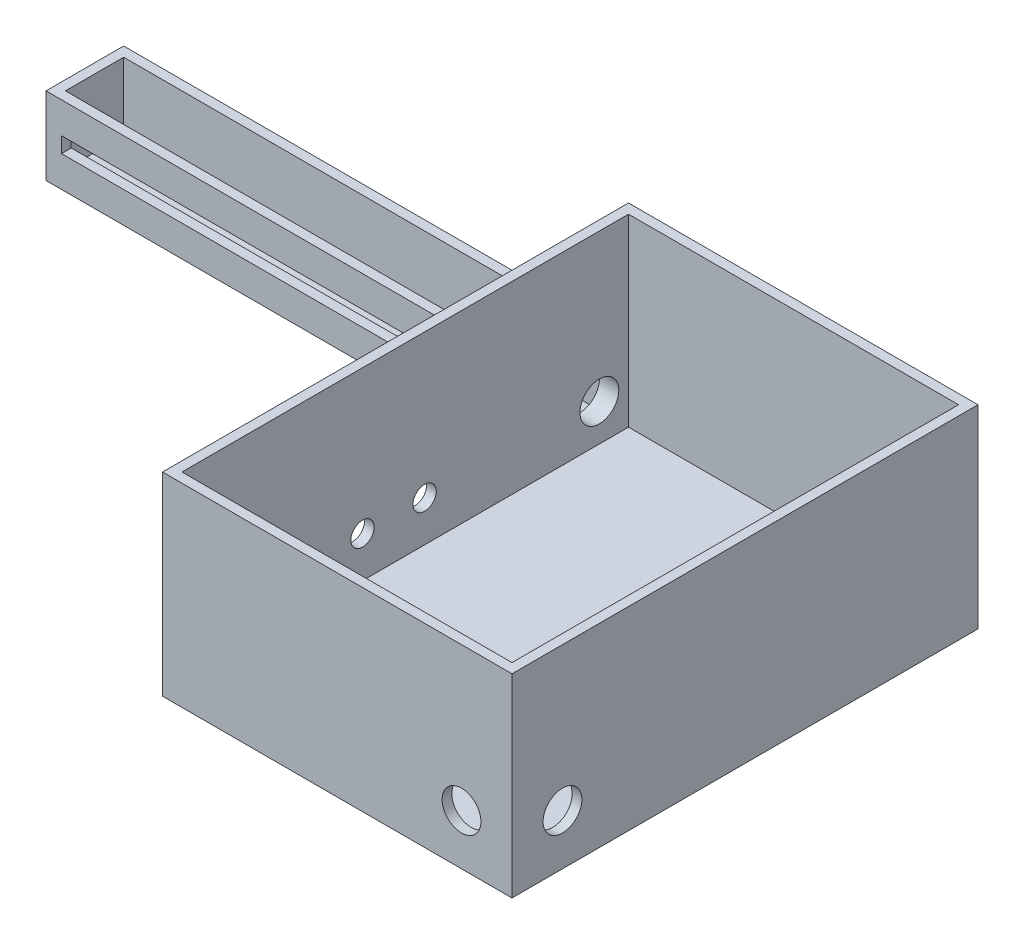
ISO-10303-21;
HEADER;
FILE_DESCRIPTION(('STEP AP214'),'2;1');
FILE_NAME('part.step','',(''),(''),'','','');
FILE_SCHEMA(('AUTOMOTIVE_DESIGN { 1 0 10303 214 1 1 1 1 }'));
ENDSEC;
DATA;
#1=APPLICATION_CONTEXT('core data for automotive mechanical design processes');
#2=APPLICATION_PROTOCOL_DEFINITION('international standard','automotive_design',2000,#1);
#3=PRODUCT_CONTEXT('',#1,'mechanical');
#4=PRODUCT('Part','Part','',(#3));
#5=PRODUCT_RELATED_PRODUCT_CATEGORY('part','',(#4));
#6=PRODUCT_DEFINITION_FORMATION('','',#4);
#7=PRODUCT_DEFINITION_CONTEXT('part definition',#1,'design');
#8=PRODUCT_DEFINITION('design','',#6,#7);
#9=PRODUCT_DEFINITION_SHAPE('','',#8);
#10=(LENGTH_UNIT() NAMED_UNIT(*) SI_UNIT(.MILLI.,.METRE.));
#11=(NAMED_UNIT(*) PLANE_ANGLE_UNIT() SI_UNIT($,.RADIAN.));
#12=(NAMED_UNIT(*) SI_UNIT($,.STERADIAN.) SOLID_ANGLE_UNIT());
#13=UNCERTAINTY_MEASURE_WITH_UNIT(LENGTH_MEASURE(1.E-05),#10,'distance_accuracy_value','');
#14=(GEOMETRIC_REPRESENTATION_CONTEXT(3) GLOBAL_UNCERTAINTY_ASSIGNED_CONTEXT((#13)) GLOBAL_UNIT_ASSIGNED_CONTEXT((#10,
#11,#12)) REPRESENTATION_CONTEXT('',''));
#15=CARTESIAN_POINT('',(0.,0.,0.));
#16=DIRECTION('',(0.,0.,1.));
#17=DIRECTION('',(1.,0.,0.));
#18=AXIS2_PLACEMENT_3D('',#15,#16,#17);
#19=CARTESIAN_POINT('',(-82.55,63.5,-12.7));
#20=DIRECTION('',(1.,0.,0.));
#21=DIRECTION('',(0.,0.,-1.));
#22=AXIS2_PLACEMENT_3D('',#19,#20,#21);
#23=PLANE('',#22);
#24=DIRECTION('',(0.,0.,1.));
#25=VECTOR('',#24,1.);
#26=CARTESIAN_POINT('',(-82.55,25.4,-12.7));
#27=LINE('',#26,#25);
#28=CARTESIAN_POINT('',(-82.55,25.4,-12.7));
#29=VERTEX_POINT('',#28);
#30=CARTESIAN_POINT('',(-82.55,25.4,12.7));
#31=VERTEX_POINT('',#30);
#32=EDGE_CURVE('E256',#29,#31,#27,.T.);
#33=ORIENTED_EDGE('',*,*,#32,.F.);
#34=DIRECTION('',(0.,-1.,0.));
#35=VECTOR('',#34,1.);
#36=CARTESIAN_POINT('',(-82.55,63.5,-12.7));
#37=LINE('',#36,#35);
#38=CARTESIAN_POINT('',(-82.55,0.,-12.7));
#39=VERTEX_POINT('',#38);
#40=EDGE_CURVE('E306',#29,#39,#37,.T.);
#41=ORIENTED_EDGE('',*,*,#40,.T.);
#42=DIRECTION('',(0.,0.,1.));
#43=VECTOR('',#42,1.);
#44=CARTESIAN_POINT('',(-82.55,0.,-12.7));
#45=LINE('',#44,#43);
#46=CARTESIAN_POINT('',(-82.55,0.,12.7));
#47=VERTEX_POINT('',#46);
#48=EDGE_CURVE('E298',#39,#47,#45,.T.);
#49=ORIENTED_EDGE('',*,*,#48,.T.);
#50=DIRECTION('',(0.,-1.,0.));
#51=VECTOR('',#50,1.);
#52=CARTESIAN_POINT('',(-82.55,63.5,12.7));
#53=LINE('',#52,#51);
#54=EDGE_CURVE('E304',#31,#47,#53,.T.);
#55=ORIENTED_EDGE('',*,*,#54,.F.);
#56=EDGE_LOOP('',(#33,#41,#49,#55));
#57=FACE_BOUND('',#56,.T.);
#58=ADVANCED_FACE('F33',(#57),#23,.F.);
#59=CARTESIAN_POINT('',(-82.55,63.5,12.7));
#60=DIRECTION('',(0.,0.,-1.));
#61=DIRECTION('',(-1.,0.,0.));
#62=AXIS2_PLACEMENT_3D('',#59,#60,#61);
#63=PLANE('',#62);
#64=DIRECTION('',(1.,0.,0.));
#65=VECTOR('',#64,1.);
#66=CARTESIAN_POINT('',(-77.47,10.16,12.7));
#67=LINE('',#66,#65);
#68=CARTESIAN_POINT('',(-77.47,10.16,12.7));
#69=VERTEX_POINT('',#68);
#70=CARTESIAN_POINT('',(77.47,10.16,12.7));
#71=VERTEX_POINT('',#70);
#72=EDGE_CURVE('E178',#69,#71,#67,.T.);
#73=ORIENTED_EDGE('',*,*,#72,.F.);
#74=DIRECTION('',(0.,-1.,0.));
#75=VECTOR('',#74,1.);
#76=CARTESIAN_POINT('',(-77.47,15.24,12.7));
#77=LINE('',#76,#75);
#78=CARTESIAN_POINT('',(-77.47,15.24,12.7));
#79=VERTEX_POINT('',#78);
#80=EDGE_CURVE('E50',#79,#69,#77,.T.);
#81=ORIENTED_EDGE('',*,*,#80,.F.);
#82=DIRECTION('',(-1.,0.,0.));
#83=VECTOR('',#82,1.);
#84=CARTESIAN_POINT('',(-77.47,15.24,12.7));
#85=LINE('',#84,#83);
#86=CARTESIAN_POINT('',(77.47,15.24,12.7));
#87=VERTEX_POINT('',#86);
#88=EDGE_CURVE('E185',#87,#79,#85,.T.);
#89=ORIENTED_EDGE('',*,*,#88,.F.);
#90=DIRECTION('',(0.,1.,0.));
#91=VECTOR('',#90,1.);
#92=CARTESIAN_POINT('',(77.47,15.24,12.7));
#93=LINE('',#92,#91);
#94=EDGE_CURVE('E169',#71,#87,#93,.T.);
#95=ORIENTED_EDGE('',*,*,#94,.F.);
#96=EDGE_LOOP('',(#73,#81,#89,#95));
#97=FACE_BOUND('',#96,.T.);
#98=DIRECTION('',(1.,0.,0.));
#99=VECTOR('',#98,1.);
#100=CARTESIAN_POINT('',(-82.55,25.4,12.7));
#101=LINE('',#100,#99);
#102=CARTESIAN_POINT('',(82.55,25.4,12.7));
#103=VERTEX_POINT('',#102);
#104=EDGE_CURVE('E264',#31,#103,#101,.T.);
#105=ORIENTED_EDGE('',*,*,#104,.F.);
#106=ORIENTED_EDGE('',*,*,#54,.T.);
#107=DIRECTION('',(1.,0.,0.));
#108=VECTOR('',#107,1.);
#109=CARTESIAN_POINT('',(-82.55,0.,12.7));
#110=LINE('',#109,#108);
#111=CARTESIAN_POINT('',(82.55,0.,12.7));
#112=VERTEX_POINT('',#111);
#113=EDGE_CURVE('E280',#47,#112,#110,.T.);
#114=ORIENTED_EDGE('',*,*,#113,.T.);
#115=DIRECTION('',(0.,-1.,0.));
#116=VECTOR('',#115,1.);
#117=CARTESIAN_POINT('',(82.55,63.5,12.7));
#118=LINE('',#117,#116);
#119=EDGE_CURVE('E287',#103,#112,#118,.T.);
#120=ORIENTED_EDGE('',*,*,#119,.F.);
#121=EDGE_LOOP('',(#105,#106,#114,#120));
#122=FACE_BOUND('',#121,.T.);
#123=ADVANCED_FACE('F182',(#97,#122),#63,.F.);
#124=CARTESIAN_POINT('',(82.55,63.5,12.7));
#125=DIRECTION('',(1.,0.,0.));
#126=DIRECTION('',(0.,0.,-1.));
#127=AXIS2_PLACEMENT_3D('',#124,#125,#126);
#128=PLANE('',#127);
#129=CARTESIAN_POINT('',(82.55,16.51,57.15));
#130=DIRECTION('',(-1.,0.,0.));
#131=DIRECTION('',(0.,0.,1.));
#132=AXIS2_PLACEMENT_3D('',#129,#130,#131);
#133=CIRCLE('',#132,3.81);
#134=CARTESIAN_POINT('',(82.55,16.51,60.96));
#135=VERTEX_POINT('',#134);
#136=EDGE_CURVE('E328',#135,#135,#133,.T.);
#137=ORIENTED_EDGE('',*,*,#136,.F.);
#138=EDGE_LOOP('',(#137));
#139=FACE_BOUND('',#138,.T.);
#140=CARTESIAN_POINT('',(82.55,16.51,77.47));
#141=DIRECTION('',(-1.,0.,0.));
#142=DIRECTION('',(0.,0.,1.));
#143=AXIS2_PLACEMENT_3D('',#140,#141,#142);
#144=CIRCLE('',#143,3.81);
#145=CARTESIAN_POINT('',(82.55,16.51,81.28));
#146=VERTEX_POINT('',#145);
#147=EDGE_CURVE('E340',#146,#146,#144,.T.);
#148=ORIENTED_EDGE('',*,*,#147,.F.);
#149=EDGE_LOOP('',(#148));
#150=FACE_BOUND('',#149,.T.);
#151=CARTESIAN_POINT('',(82.55,16.51,97.79));
#152=DIRECTION('',(-1.,0.,0.));
#153=DIRECTION('',(0.,0.,1.));
#154=AXIS2_PLACEMENT_3D('',#151,#152,#153);
#155=CIRCLE('',#154,3.81);
#156=CARTESIAN_POINT('',(82.55,16.51,101.6));
#157=VERTEX_POINT('',#156);
#158=EDGE_CURVE('E335',#157,#157,#155,.T.);
#159=ORIENTED_EDGE('',*,*,#158,.F.);
#160=EDGE_LOOP('',(#159));
#161=FACE_BOUND('',#160,.T.);
#162=DIRECTION('',(0.,0.,1.));
#163=VECTOR('',#162,1.);
#164=CARTESIAN_POINT('',(82.55,0.,12.7));
#165=LINE('',#164,#163);
#166=CARTESIAN_POINT('',(82.55,0.,139.7));
#167=VERTEX_POINT('',#166);
#168=EDGE_CURVE('E275',#112,#167,#165,.T.);
#169=ORIENTED_EDGE('',*,*,#168,.T.);
#170=DIRECTION('',(0.,-1.,0.));
#171=VECTOR('',#170,1.);
#172=CARTESIAN_POINT('',(82.55,63.5,139.7));
#173=LINE('',#172,#171);
#174=CARTESIAN_POINT('',(82.55,63.5,139.7));
#175=VERTEX_POINT('',#174);
#176=EDGE_CURVE('E314',#175,#167,#173,.T.);
#177=ORIENTED_EDGE('',*,*,#176,.F.);
#178=DIRECTION('',(0.,0.,1.));
#179=VECTOR('',#178,1.);
#180=CARTESIAN_POINT('',(82.55,63.5,12.7));
#181=LINE('',#180,#179);
#182=CARTESIAN_POINT('',(82.55,63.5,-12.7));
#183=VERTEX_POINT('',#182);
#184=EDGE_CURVE('E276',#183,#175,#181,.T.);
#185=ORIENTED_EDGE('',*,*,#184,.F.);
#186=DIRECTION('',(0.,1.,0.));
#187=VECTOR('',#186,1.);
#188=CARTESIAN_POINT('',(82.55,25.4,-12.7));
#189=LINE('',#188,#187);
#190=CARTESIAN_POINT('',(82.55,25.4,-12.7));
#191=VERTEX_POINT('',#190);
#192=EDGE_CURVE('E272',#191,#183,#189,.T.);
#193=ORIENTED_EDGE('',*,*,#192,.F.);
#194=DIRECTION('',(0.,0.,-1.));
#195=VECTOR('',#194,1.);
#196=CARTESIAN_POINT('',(82.55,25.4,-12.7));
#197=LINE('',#196,#195);
#198=EDGE_CURVE('E267',#103,#191,#197,.T.);
#199=ORIENTED_EDGE('',*,*,#198,.F.);
#200=ORIENTED_EDGE('',*,*,#119,.T.);
#201=EDGE_LOOP('',(#169,#177,#185,#193,#199,#200));
#202=FACE_BOUND('',#201,.T.);
#203=ADVANCED_FACE('F35',(#139,#150,#161,#202),#128,.F.);
#204=CARTESIAN_POINT('',(82.55,63.5,139.7));
#205=DIRECTION('',(0.,0.,-1.));
#206=DIRECTION('',(-1.,0.,0.));
#207=AXIS2_PLACEMENT_3D('',#204,#205,#206);
#208=PLANE('',#207);
#209=CARTESIAN_POINT('',(180.34,16.51,139.7));
#210=DIRECTION('',(0.,0.,1.));
#211=DIRECTION('',(1.,0.,0.));
#212=AXIS2_PLACEMENT_3D('',#209,#210,#211);
#213=CIRCLE('',#212,6.35);
#214=CARTESIAN_POINT('',(186.69,16.51,139.7));
#215=VERTEX_POINT('',#214);
#216=EDGE_CURVE('E336',#215,#215,#213,.T.);
#217=ORIENTED_EDGE('',*,*,#216,.F.);
#218=EDGE_LOOP('',(#217));
#219=FACE_BOUND('',#218,.T.);
#220=DIRECTION('',(1.,0.,0.));
#221=VECTOR('',#220,1.);
#222=CARTESIAN_POINT('',(82.55,0.,139.7));
#223=LINE('',#222,#221);
#224=CARTESIAN_POINT('',(196.85,0.,139.7));
#225=VERTEX_POINT('',#224);
#226=EDGE_CURVE('E290',#167,#225,#223,.T.);
#227=ORIENTED_EDGE('',*,*,#226,.T.);
#228=DIRECTION('',(0.,-1.,0.));
#229=VECTOR('',#228,1.);
#230=CARTESIAN_POINT('',(196.85,63.5,139.7));
#231=LINE('',#230,#229);
#232=CARTESIAN_POINT('',(196.85,63.5,139.7));
#233=VERTEX_POINT('',#232);
#234=EDGE_CURVE('E311',#233,#225,#231,.T.);
#235=ORIENTED_EDGE('',*,*,#234,.F.);
#236=DIRECTION('',(1.,0.,0.));
#237=VECTOR('',#236,1.);
#238=CARTESIAN_POINT('',(82.55,63.5,139.7));
#239=LINE('',#238,#237);
#240=EDGE_CURVE('E279',#175,#233,#239,.T.);
#241=ORIENTED_EDGE('',*,*,#240,.F.);
#242=ORIENTED_EDGE('',*,*,#176,.T.);
#243=EDGE_LOOP('',(#227,#235,#241,#242));
#244=FACE_BOUND('',#243,.T.);
#245=ADVANCED_FACE('F360',(#219,#244),#208,.F.);
#246=CARTESIAN_POINT('',(196.85,63.5,-12.7));
#247=DIRECTION('',(-1.,0.,0.));
#248=DIRECTION('',(0.,0.,1.));
#249=AXIS2_PLACEMENT_3D('',#246,#247,#248);
#250=PLANE('',#249);
#251=CARTESIAN_POINT('',(196.85,16.51,123.19));
#252=DIRECTION('',(1.,0.,0.));
#253=DIRECTION('',(0.,0.,-1.));
#254=AXIS2_PLACEMENT_3D('',#251,#252,#253);
#255=CIRCLE('',#254,6.35);
#256=CARTESIAN_POINT('',(196.85,16.51,116.84));
#257=VERTEX_POINT('',#256);
#258=EDGE_CURVE('E347',#257,#257,#255,.T.);
#259=ORIENTED_EDGE('',*,*,#258,.F.);
#260=EDGE_LOOP('',(#259));
#261=FACE_BOUND('',#260,.T.);
#262=DIRECTION('',(0.,0.,-1.));
#263=VECTOR('',#262,1.);
#264=CARTESIAN_POINT('',(196.85,0.,-12.7));
#265=LINE('',#264,#263);
#266=CARTESIAN_POINT('',(196.85,0.,-12.7));
#267=VERTEX_POINT('',#266);
#268=EDGE_CURVE('E292',#225,#267,#265,.T.);
#269=ORIENTED_EDGE('',*,*,#268,.T.);
#270=DIRECTION('',(0.,-1.,0.));
#271=VECTOR('',#270,1.);
#272=CARTESIAN_POINT('',(196.85,63.5,-12.7));
#273=LINE('',#272,#271);
#274=CARTESIAN_POINT('',(196.85,63.5,-12.7));
#275=VERTEX_POINT('',#274);
#276=EDGE_CURVE('E308',#275,#267,#273,.T.);
#277=ORIENTED_EDGE('',*,*,#276,.F.);
#278=DIRECTION('',(0.,0.,-1.));
#279=VECTOR('',#278,1.);
#280=CARTESIAN_POINT('',(196.85,63.5,-12.7));
#281=LINE('',#280,#279);
#282=EDGE_CURVE('E282',#233,#275,#281,.T.);
#283=ORIENTED_EDGE('',*,*,#282,.F.);
#284=ORIENTED_EDGE('',*,*,#234,.T.);
#285=EDGE_LOOP('',(#269,#277,#283,#284));
#286=FACE_BOUND('',#285,.T.);
#287=ADVANCED_FACE('F399',(#261,#286),#250,.F.);
#288=CARTESIAN_POINT('',(-82.55,63.5,-12.7));
#289=DIRECTION('',(0.,0.,1.));
#290=DIRECTION('',(1.,0.,0.));
#291=AXIS2_PLACEMENT_3D('',#288,#289,#290);
#292=PLANE('',#291);
#293=DIRECTION('',(-1.,0.,0.));
#294=VECTOR('',#293,1.);
#295=CARTESIAN_POINT('',(-82.55,25.4,-12.7));
#296=LINE('',#295,#294);
#297=EDGE_CURVE('E270',#191,#29,#296,.T.);
#298=ORIENTED_EDGE('',*,*,#297,.F.);
#299=ORIENTED_EDGE('',*,*,#192,.T.);
#300=DIRECTION('',(-1.,0.,0.));
#301=VECTOR('',#300,1.);
#302=CARTESIAN_POINT('',(82.55,63.5,-12.7));
#303=LINE('',#302,#301);
#304=EDGE_CURVE('E284',#275,#183,#303,.T.);
#305=ORIENTED_EDGE('',*,*,#304,.F.);
#306=ORIENTED_EDGE('',*,*,#276,.T.);
#307=DIRECTION('',(-1.,0.,0.));
#308=VECTOR('',#307,1.);
#309=CARTESIAN_POINT('',(-82.55,0.,-12.7));
#310=LINE('',#309,#308);
#311=EDGE_CURVE('E295',#267,#39,#310,.T.);
#312=ORIENTED_EDGE('',*,*,#311,.T.);
#313=ORIENTED_EDGE('',*,*,#40,.F.);
#314=EDGE_LOOP('',(#298,#299,#305,#306,#312,#313));
#315=FACE_BOUND('',#314,.T.);
#316=ADVANCED_FACE('F380',(#315),#292,.F.);
#317=CARTESIAN_POINT('',(0.,63.5,0.));
#318=DIRECTION('',(0.,1.,0.));
#319=DIRECTION('',(0.,0.,1.));
#320=AXIS2_PLACEMENT_3D('',#317,#318,#319);
#321=PLANE('',#320);
#322=DIRECTION('',(0.,0.,1.));
#323=VECTOR('',#322,1.);
#324=CARTESIAN_POINT('',(85.725,63.5,-9.525));
#325=LINE('',#324,#323);
#326=CARTESIAN_POINT('',(85.725,63.5,-9.525));
#327=VERTEX_POINT('',#326);
#328=CARTESIAN_POINT('',(85.725,63.5,136.525));
#329=VERTEX_POINT('',#328);
#330=EDGE_CURVE('E224',#327,#329,#325,.T.);
#331=ORIENTED_EDGE('',*,*,#330,.F.);
#332=DIRECTION('',(-1.,0.,0.));
#333=VECTOR('',#332,1.);
#334=CARTESIAN_POINT('',(85.725,63.5,-9.525));
#335=LINE('',#334,#333);
#336=CARTESIAN_POINT('',(193.675,63.5,-9.525));
#337=VERTEX_POINT('',#336);
#338=EDGE_CURVE('E235',#337,#327,#335,.T.);
#339=ORIENTED_EDGE('',*,*,#338,.F.);
#340=DIRECTION('',(0.,0.,-1.));
#341=VECTOR('',#340,1.);
#342=CARTESIAN_POINT('',(193.675,63.5,-9.525));
#343=LINE('',#342,#341);
#344=CARTESIAN_POINT('',(193.675,63.5,136.525));
#345=VERTEX_POINT('',#344);
#346=EDGE_CURVE('E249',#345,#337,#343,.T.);
#347=ORIENTED_EDGE('',*,*,#346,.F.);
#348=DIRECTION('',(1.,0.,0.));
#349=VECTOR('',#348,1.);
#350=CARTESIAN_POINT('',(85.725,63.5,136.525));
#351=LINE('',#350,#349);
#352=EDGE_CURVE('E246',#329,#345,#351,.T.);
#353=ORIENTED_EDGE('',*,*,#352,.F.);
#354=EDGE_LOOP('',(#331,#339,#347,#353));
#355=FACE_BOUND('',#354,.T.);
#356=ORIENTED_EDGE('',*,*,#304,.T.);
#357=ORIENTED_EDGE('',*,*,#184,.T.);
#358=ORIENTED_EDGE('',*,*,#240,.T.);
#359=ORIENTED_EDGE('',*,*,#282,.T.);
#360=EDGE_LOOP('',(#356,#357,#358,#359));
#361=FACE_BOUND('',#360,.T.);
#362=ADVANCED_FACE('F376',(#355,#361),#321,.T.);
#363=CARTESIAN_POINT('',(0.,0.,0.));
#364=DIRECTION('',(0.,1.,0.));
#365=DIRECTION('',(0.,0.,1.));
#366=AXIS2_PLACEMENT_3D('',#363,#364,#365);
#367=PLANE('',#366);
#368=ORIENTED_EDGE('',*,*,#168,.F.);
#369=ORIENTED_EDGE('',*,*,#113,.F.);
#370=ORIENTED_EDGE('',*,*,#48,.F.);
#371=ORIENTED_EDGE('',*,*,#311,.F.);
#372=ORIENTED_EDGE('',*,*,#268,.F.);
#373=ORIENTED_EDGE('',*,*,#226,.F.);
#374=EDGE_LOOP('',(#368,#369,#370,#371,#372,#373));
#375=FACE_BOUND('',#374,.T.);
#376=ADVANCED_FACE('F369',(#375),#367,.F.);
#377=CARTESIAN_POINT('',(0.,25.4,0.));
#378=DIRECTION('',(0.,1.,0.));
#379=DIRECTION('',(0.,0.,1.));
#380=AXIS2_PLACEMENT_3D('',#377,#378,#379);
#381=PLANE('',#380);
#382=DIRECTION('',(0.,0.,1.));
#383=VECTOR('',#382,1.);
#384=CARTESIAN_POINT('',(-79.375,25.4,-9.525));
#385=LINE('',#384,#383);
#386=CARTESIAN_POINT('',(-79.375,25.4,-9.525));
#387=VERTEX_POINT('',#386);
#388=CARTESIAN_POINT('',(-79.375,25.4,9.525));
#389=VERTEX_POINT('',#388);
#390=EDGE_CURVE('E198',#387,#389,#385,.T.);
#391=ORIENTED_EDGE('',*,*,#390,.F.);
#392=DIRECTION('',(-1.,0.,0.));
#393=VECTOR('',#392,1.);
#394=CARTESIAN_POINT('',(-79.375,25.4,-9.525));
#395=LINE('',#394,#393);
#396=CARTESIAN_POINT('',(79.375,25.4,-9.525));
#397=VERTEX_POINT('',#396);
#398=EDGE_CURVE('E203',#397,#387,#395,.T.);
#399=ORIENTED_EDGE('',*,*,#398,.F.);
#400=DIRECTION('',(0.,0.,-1.));
#401=VECTOR('',#400,1.);
#402=CARTESIAN_POINT('',(79.375,25.4,-9.525));
#403=LINE('',#402,#401);
#404=CARTESIAN_POINT('',(79.375,25.4,9.525));
#405=VERTEX_POINT('',#404);
#406=EDGE_CURVE('E217',#405,#397,#403,.T.);
#407=ORIENTED_EDGE('',*,*,#406,.F.);
#408=DIRECTION('',(1.,0.,0.));
#409=VECTOR('',#408,1.);
#410=CARTESIAN_POINT('',(-79.375,25.4,9.525));
#411=LINE('',#410,#409);
#412=EDGE_CURVE('E214',#389,#405,#411,.T.);
#413=ORIENTED_EDGE('',*,*,#412,.F.);
#414=EDGE_LOOP('',(#391,#399,#407,#413));
#415=FACE_BOUND('',#414,.T.);
#416=ORIENTED_EDGE('',*,*,#32,.T.);
#417=ORIENTED_EDGE('',*,*,#104,.T.);
#418=ORIENTED_EDGE('',*,*,#198,.T.);
#419=ORIENTED_EDGE('',*,*,#297,.T.);
#420=EDGE_LOOP('',(#416,#417,#418,#419));
#421=FACE_BOUND('',#420,.T.);
#422=ADVANCED_FACE('F384',(#415,#421),#381,.T.);
#423=CARTESIAN_POINT('',(85.725,3.175,-9.525));
#424=DIRECTION('',(-1.,0.,0.));
#425=DIRECTION('',(0.,0.,1.));
#426=AXIS2_PLACEMENT_3D('',#423,#424,#425);
#427=PLANE('',#426);
#428=CARTESIAN_POINT('',(85.725,16.51,57.15));
#429=DIRECTION('',(-1.,0.,0.));
#430=DIRECTION('',(0.,0.,1.));
#431=AXIS2_PLACEMENT_3D('',#428,#429,#430);
#432=CIRCLE('',#431,3.81);
#433=CARTESIAN_POINT('',(85.725,16.51,60.96));
#434=VERTEX_POINT('',#433);
#435=EDGE_CURVE('E331',#434,#434,#432,.T.);
#436=ORIENTED_EDGE('',*,*,#435,.T.);
#437=EDGE_LOOP('',(#436));
#438=FACE_BOUND('',#437,.T.);
#439=CARTESIAN_POINT('',(85.725,16.51,77.47));
#440=DIRECTION('',(-1.,0.,0.));
#441=DIRECTION('',(0.,0.,1.));
#442=AXIS2_PLACEMENT_3D('',#439,#440,#441);
#443=CIRCLE('',#442,3.81);
#444=CARTESIAN_POINT('',(85.725,16.51,81.28));
#445=VERTEX_POINT('',#444);
#446=EDGE_CURVE('E327',#445,#445,#443,.T.);
#447=ORIENTED_EDGE('',*,*,#446,.T.);
#448=EDGE_LOOP('',(#447));
#449=FACE_BOUND('',#448,.T.);
#450=CARTESIAN_POINT('',(85.725,16.51,97.79));
#451=DIRECTION('',(-1.,0.,0.));
#452=DIRECTION('',(0.,0.,1.));
#453=AXIS2_PLACEMENT_3D('',#450,#451,#452);
#454=CIRCLE('',#453,3.81);
#455=CARTESIAN_POINT('',(85.725,16.51,101.6));
#456=VERTEX_POINT('',#455);
#457=EDGE_CURVE('E324',#456,#456,#454,.T.);
#458=ORIENTED_EDGE('',*,*,#457,.T.);
#459=EDGE_LOOP('',(#458));
#460=FACE_BOUND('',#459,.T.);
#461=CARTESIAN_POINT('',(85.725,15.24,0.));
#462=DIRECTION('',(-1.,0.,0.));
#463=DIRECTION('',(0.,0.,1.));
#464=AXIS2_PLACEMENT_3D('',#461,#462,#463);
#465=CIRCLE('',#464,6.35);
#466=CARTESIAN_POINT('',(85.725,15.24,6.35));
#467=VERTEX_POINT('',#466);
#468=EDGE_CURVE('E195',#467,#467,#465,.F.);
#469=ORIENTED_EDGE('',*,*,#468,.F.);
#470=EDGE_LOOP('',(#469));
#471=FACE_BOUND('',#470,.T.);
#472=ORIENTED_EDGE('',*,*,#330,.T.);
#473=DIRECTION('',(0.,1.,0.));
#474=VECTOR('',#473,1.);
#475=CARTESIAN_POINT('',(85.725,3.175,136.525));
#476=LINE('',#475,#474);
#477=CARTESIAN_POINT('',(85.725,3.175,136.525));
#478=VERTEX_POINT('',#477);
#479=EDGE_CURVE('E244',#478,#329,#476,.T.);
#480=ORIENTED_EDGE('',*,*,#479,.F.);
#481=DIRECTION('',(0.,0.,1.));
#482=VECTOR('',#481,1.);
#483=CARTESIAN_POINT('',(85.725,3.175,-9.525));
#484=LINE('',#483,#482);
#485=CARTESIAN_POINT('',(85.725,3.175,-9.525));
#486=VERTEX_POINT('',#485);
#487=EDGE_CURVE('E231',#486,#478,#484,.T.);
#488=ORIENTED_EDGE('',*,*,#487,.F.);
#489=DIRECTION('',(0.,1.,0.));
#490=VECTOR('',#489,1.);
#491=CARTESIAN_POINT('',(85.725,3.175,-9.525));
#492=LINE('',#491,#490);
#493=EDGE_CURVE('E254',#486,#327,#492,.T.);
#494=ORIENTED_EDGE('',*,*,#493,.T.);
#495=EDGE_LOOP('',(#472,#480,#488,#494));
#496=FACE_BOUND('',#495,.T.);
#497=ADVANCED_FACE('F439',(#438,#449,#460,#471,#496),#427,.F.);
#498=CARTESIAN_POINT('',(85.725,3.175,-9.525));
#499=DIRECTION('',(0.,0.,-1.));
#500=DIRECTION('',(-1.,0.,0.));
#501=AXIS2_PLACEMENT_3D('',#498,#499,#500);
#502=PLANE('',#501);
#503=ORIENTED_EDGE('',*,*,#338,.T.);
#504=ORIENTED_EDGE('',*,*,#493,.F.);
#505=DIRECTION('',(-1.,0.,0.));
#506=VECTOR('',#505,1.);
#507=CARTESIAN_POINT('',(85.725,3.175,-9.525));
#508=LINE('',#507,#506);
#509=CARTESIAN_POINT('',(193.675,3.175,-9.525));
#510=VERTEX_POINT('',#509);
#511=EDGE_CURVE('E241',#510,#486,#508,.T.);
#512=ORIENTED_EDGE('',*,*,#511,.F.);
#513=DIRECTION('',(0.,1.,0.));
#514=VECTOR('',#513,1.);
#515=CARTESIAN_POINT('',(193.675,3.175,-9.525));
#516=LINE('',#515,#514);
#517=EDGE_CURVE('E257',#510,#337,#516,.T.);
#518=ORIENTED_EDGE('',*,*,#517,.T.);
#519=EDGE_LOOP('',(#503,#504,#512,#518));
#520=FACE_BOUND('',#519,.T.);
#521=ADVANCED_FACE('F449',(#520),#502,.F.);
#522=CARTESIAN_POINT('',(193.675,3.175,-9.525));
#523=DIRECTION('',(1.,0.,0.));
#524=DIRECTION('',(0.,0.,-1.));
#525=AXIS2_PLACEMENT_3D('',#522,#523,#524);
#526=PLANE('',#525);
#527=CARTESIAN_POINT('',(193.675,16.51,123.19));
#528=DIRECTION('',(1.,0.,0.));
#529=DIRECTION('',(0.,0.,-1.));
#530=AXIS2_PLACEMENT_3D('',#527,#528,#529);
#531=CIRCLE('',#530,6.35);
#532=CARTESIAN_POINT('',(193.675,16.51,116.84));
#533=VERTEX_POINT('',#532);
#534=EDGE_CURVE('E37',#533,#533,#531,.T.);
#535=ORIENTED_EDGE('',*,*,#534,.T.);
#536=EDGE_LOOP('',(#535));
#537=FACE_BOUND('',#536,.T.);
#538=ORIENTED_EDGE('',*,*,#346,.T.);
#539=ORIENTED_EDGE('',*,*,#517,.F.);
#540=DIRECTION('',(0.,0.,-1.));
#541=VECTOR('',#540,1.);
#542=CARTESIAN_POINT('',(193.675,3.175,-9.525));
#543=LINE('',#542,#541);
#544=CARTESIAN_POINT('',(193.675,3.175,136.525));
#545=VERTEX_POINT('',#544);
#546=EDGE_CURVE('E238',#545,#510,#543,.T.);
#547=ORIENTED_EDGE('',*,*,#546,.F.);
#548=DIRECTION('',(0.,1.,0.));
#549=VECTOR('',#548,1.);
#550=CARTESIAN_POINT('',(193.675,3.175,136.525));
#551=LINE('',#550,#549);
#552=EDGE_CURVE('E259',#545,#345,#551,.T.);
#553=ORIENTED_EDGE('',*,*,#552,.T.);
#554=EDGE_LOOP('',(#538,#539,#547,#553));
#555=FACE_BOUND('',#554,.T.);
#556=ADVANCED_FACE('F457',(#537,#555),#526,.F.);
#557=CARTESIAN_POINT('',(85.725,3.175,136.525));
#558=DIRECTION('',(0.,0.,1.));
#559=DIRECTION('',(1.,0.,0.));
#560=AXIS2_PLACEMENT_3D('',#557,#558,#559);
#561=PLANE('',#560);
#562=CARTESIAN_POINT('',(180.34,16.51,136.525));
#563=DIRECTION('',(0.,0.,1.));
#564=DIRECTION('',(1.,0.,0.));
#565=AXIS2_PLACEMENT_3D('',#562,#563,#564);
#566=CIRCLE('',#565,6.35);
#567=CARTESIAN_POINT('',(186.69,16.51,136.525));
#568=VERTEX_POINT('',#567);
#569=EDGE_CURVE('E333',#568,#568,#566,.T.);
#570=ORIENTED_EDGE('',*,*,#569,.T.);
#571=EDGE_LOOP('',(#570));
#572=FACE_BOUND('',#571,.T.);
#573=ORIENTED_EDGE('',*,*,#352,.T.);
#574=ORIENTED_EDGE('',*,*,#552,.F.);
#575=DIRECTION('',(1.,0.,0.));
#576=VECTOR('',#575,1.);
#577=CARTESIAN_POINT('',(85.725,3.175,136.525));
#578=LINE('',#577,#576);
#579=EDGE_CURVE('E234',#478,#545,#578,.T.);
#580=ORIENTED_EDGE('',*,*,#579,.F.);
#581=ORIENTED_EDGE('',*,*,#479,.T.);
#582=EDGE_LOOP('',(#573,#574,#580,#581));
#583=FACE_BOUND('',#582,.T.);
#584=ADVANCED_FACE('F464',(#572,#583),#561,.F.);
#585=CARTESIAN_POINT('',(0.,3.175,0.));
#586=DIRECTION('',(0.,1.,0.));
#587=DIRECTION('',(0.,0.,1.));
#588=AXIS2_PLACEMENT_3D('',#585,#586,#587);
#589=PLANE('',#588);
#590=ORIENTED_EDGE('',*,*,#487,.T.);
#591=ORIENTED_EDGE('',*,*,#579,.T.);
#592=ORIENTED_EDGE('',*,*,#546,.T.);
#593=ORIENTED_EDGE('',*,*,#511,.T.);
#594=EDGE_LOOP('',(#590,#591,#592,#593));
#595=FACE_BOUND('',#594,.T.);
#596=ADVANCED_FACE('F472',(#595),#589,.T.);
#597=CARTESIAN_POINT('',(-79.375,3.175,-9.525));
#598=DIRECTION('',(-1.,0.,0.));
#599=DIRECTION('',(0.,0.,1.));
#600=AXIS2_PLACEMENT_3D('',#597,#598,#599);
#601=PLANE('',#600);
#602=ORIENTED_EDGE('',*,*,#390,.T.);
#603=DIRECTION('',(0.,1.,0.));
#604=VECTOR('',#603,1.);
#605=CARTESIAN_POINT('',(-79.375,3.175,9.525));
#606=LINE('',#605,#604);
#607=CARTESIAN_POINT('',(-79.375,3.175,9.525));
#608=VERTEX_POINT('',#607);
#609=EDGE_CURVE('E212',#608,#389,#606,.T.);
#610=ORIENTED_EDGE('',*,*,#609,.F.);
#611=DIRECTION('',(0.,0.,1.));
#612=VECTOR('',#611,1.);
#613=CARTESIAN_POINT('',(-79.375,3.175,-9.525));
#614=LINE('',#613,#612);
#615=CARTESIAN_POINT('',(-79.375,3.175,-9.525));
#616=VERTEX_POINT('',#615);
#617=EDGE_CURVE('E199',#616,#608,#614,.T.);
#618=ORIENTED_EDGE('',*,*,#617,.F.);
#619=DIRECTION('',(0.,1.,0.));
#620=VECTOR('',#619,1.);
#621=CARTESIAN_POINT('',(-79.375,3.175,-9.525));
#622=LINE('',#621,#620);
#623=EDGE_CURVE('E222',#616,#387,#622,.T.);
#624=ORIENTED_EDGE('',*,*,#623,.T.);
#625=EDGE_LOOP('',(#602,#610,#618,#624));
#626=FACE_BOUND('',#625,.T.);
#627=ADVANCED_FACE('F478',(#626),#601,.F.);
#628=CARTESIAN_POINT('',(-79.375,3.175,-9.525));
#629=DIRECTION('',(0.,0.,-1.));
#630=DIRECTION('',(-1.,0.,0.));
#631=AXIS2_PLACEMENT_3D('',#628,#629,#630);
#632=PLANE('',#631);
#633=ORIENTED_EDGE('',*,*,#398,.T.);
#634=ORIENTED_EDGE('',*,*,#623,.F.);
#635=DIRECTION('',(-1.,0.,0.));
#636=VECTOR('',#635,1.);
#637=CARTESIAN_POINT('',(-79.375,3.175,-9.525));
#638=LINE('',#637,#636);
#639=CARTESIAN_POINT('',(79.375,3.175,-9.525));
#640=VERTEX_POINT('',#639);
#641=EDGE_CURVE('E209',#640,#616,#638,.T.);
#642=ORIENTED_EDGE('',*,*,#641,.F.);
#643=DIRECTION('',(0.,1.,0.));
#644=VECTOR('',#643,1.);
#645=CARTESIAN_POINT('',(79.375,3.175,-9.525));
#646=LINE('',#645,#644);
#647=EDGE_CURVE('E225',#640,#397,#646,.T.);
#648=ORIENTED_EDGE('',*,*,#647,.T.);
#649=EDGE_LOOP('',(#633,#634,#642,#648));
#650=FACE_BOUND('',#649,.T.);
#651=ADVANCED_FACE('F485',(#650),#632,.F.);
#652=CARTESIAN_POINT('',(79.375,3.175,-9.525));
#653=DIRECTION('',(1.,0.,0.));
#654=DIRECTION('',(0.,0.,-1.));
#655=AXIS2_PLACEMENT_3D('',#652,#653,#654);
#656=PLANE('',#655);
#657=CARTESIAN_POINT('',(79.375,15.24,0.));
#658=DIRECTION('',(1.,0.,0.));
#659=DIRECTION('',(0.,0.,-1.));
#660=AXIS2_PLACEMENT_3D('',#657,#658,#659);
#661=CIRCLE('',#660,6.35);
#662=CARTESIAN_POINT('',(79.375,15.24,-6.35));
#663=VERTEX_POINT('',#662);
#664=EDGE_CURVE('E192',#663,#663,#661,.F.);
#665=ORIENTED_EDGE('',*,*,#664,.F.);
#666=EDGE_LOOP('',(#665));
#667=FACE_BOUND('',#666,.T.);
#668=ORIENTED_EDGE('',*,*,#406,.T.);
#669=ORIENTED_EDGE('',*,*,#647,.F.);
#670=DIRECTION('',(0.,0.,-1.));
#671=VECTOR('',#670,1.);
#672=CARTESIAN_POINT('',(79.375,3.175,-9.525));
#673=LINE('',#672,#671);
#674=CARTESIAN_POINT('',(79.375,3.175,9.525));
#675=VERTEX_POINT('',#674);
#676=EDGE_CURVE('E206',#675,#640,#673,.T.);
#677=ORIENTED_EDGE('',*,*,#676,.F.);
#678=DIRECTION('',(0.,1.,0.));
#679=VECTOR('',#678,1.);
#680=CARTESIAN_POINT('',(79.375,3.175,9.525));
#681=LINE('',#680,#679);
#682=EDGE_CURVE('E227',#675,#405,#681,.T.);
#683=ORIENTED_EDGE('',*,*,#682,.T.);
#684=EDGE_LOOP('',(#668,#669,#677,#683));
#685=FACE_BOUND('',#684,.T.);
#686=ADVANCED_FACE('F493',(#667,#685),#656,.F.);
#687=CARTESIAN_POINT('',(-79.375,3.175,9.525));
#688=DIRECTION('',(0.,0.,1.));
#689=DIRECTION('',(1.,0.,0.));
#690=AXIS2_PLACEMENT_3D('',#687,#688,#689);
#691=PLANE('',#690);
#692=DIRECTION('',(-1.,0.,0.));
#693=VECTOR('',#692,1.);
#694=CARTESIAN_POINT('',(-79.375,15.24,9.525));
#695=LINE('',#694,#693);
#696=CARTESIAN_POINT('',(77.47,15.24,9.525));
#697=VERTEX_POINT('',#696);
#698=CARTESIAN_POINT('',(-77.47,15.24,9.525));
#699=VERTEX_POINT('',#698);
#700=EDGE_CURVE('E42',#697,#699,#695,.T.);
#701=ORIENTED_EDGE('',*,*,#700,.T.);
#702=DIRECTION('',(0.,-1.,0.));
#703=VECTOR('',#702,1.);
#704=CARTESIAN_POINT('',(-77.47,3.175,9.525));
#705=LINE('',#704,#703);
#706=CARTESIAN_POINT('',(-77.47,10.16,9.525));
#707=VERTEX_POINT('',#706);
#708=EDGE_CURVE('E11',#699,#707,#705,.T.);
#709=ORIENTED_EDGE('',*,*,#708,.T.);
#710=DIRECTION('',(1.,0.,0.));
#711=VECTOR('',#710,1.);
#712=CARTESIAN_POINT('',(-79.375,10.16,9.525));
#713=LINE('',#712,#711);
#714=CARTESIAN_POINT('',(77.47,10.16,9.525));
#715=VERTEX_POINT('',#714);
#716=EDGE_CURVE('E317',#707,#715,#713,.T.);
#717=ORIENTED_EDGE('',*,*,#716,.T.);
#718=DIRECTION('',(0.,1.,0.));
#719=VECTOR('',#718,1.);
#720=CARTESIAN_POINT('',(77.47,3.175,9.525));
#721=LINE('',#720,#719);
#722=EDGE_CURVE('E172',#715,#697,#721,.T.);
#723=ORIENTED_EDGE('',*,*,#722,.T.);
#724=EDGE_LOOP('',(#701,#709,#717,#723));
#725=FACE_BOUND('',#724,.T.);
#726=ORIENTED_EDGE('',*,*,#412,.T.);
#727=ORIENTED_EDGE('',*,*,#682,.F.);
#728=DIRECTION('',(1.,0.,0.));
#729=VECTOR('',#728,1.);
#730=CARTESIAN_POINT('',(-79.375,3.175,9.525));
#731=LINE('',#730,#729);
#732=EDGE_CURVE('E202',#608,#675,#731,.T.);
#733=ORIENTED_EDGE('',*,*,#732,.F.);
#734=ORIENTED_EDGE('',*,*,#609,.T.);
#735=EDGE_LOOP('',(#726,#727,#733,#734));
#736=FACE_BOUND('',#735,.T.);
#737=ADVANCED_FACE('F502',(#725,#736),#691,.F.);
#738=CARTESIAN_POINT('',(0.,3.175,0.));
#739=DIRECTION('',(0.,1.,0.));
#740=DIRECTION('',(0.,0.,1.));
#741=AXIS2_PLACEMENT_3D('',#738,#739,#740);
#742=PLANE('',#741);
#743=ORIENTED_EDGE('',*,*,#617,.T.);
#744=ORIENTED_EDGE('',*,*,#732,.T.);
#745=ORIENTED_EDGE('',*,*,#676,.T.);
#746=ORIENTED_EDGE('',*,*,#641,.T.);
#747=EDGE_LOOP('',(#743,#744,#745,#746));
#748=FACE_BOUND('',#747,.T.);
#749=ADVANCED_FACE('F511',(#748),#742,.T.);
#750=CARTESIAN_POINT('',(59.055,15.24,0.));
#751=DIRECTION('',(1.,0.,0.));
#752=DIRECTION('',(0.,0.,-1.));
#753=AXIS2_PLACEMENT_3D('',#750,#751,#752);
#754=CYLINDRICAL_SURFACE('',#753,6.35);
#755=ORIENTED_EDGE('',*,*,#664,.T.);
#756=EDGE_LOOP('',(#755));
#757=FACE_BOUND('',#756,.T.);
#758=ORIENTED_EDGE('',*,*,#468,.T.);
#759=EDGE_LOOP('',(#758));
#760=FACE_BOUND('',#759,.T.);
#761=ADVANCED_FACE('F519',(#757,#760),#754,.F.);
#762=CARTESIAN_POINT('',(-77.47,15.24,2.54));
#763=DIRECTION('',(-1.,0.,0.));
#764=DIRECTION('',(0.,0.,1.));
#765=AXIS2_PLACEMENT_3D('',#762,#763,#764);
#766=PLANE('',#765);
#767=DIRECTION('',(0.,0.,1.));
#768=VECTOR('',#767,1.);
#769=CARTESIAN_POINT('',(-77.47,15.24,2.54));
#770=LINE('',#769,#768);
#771=EDGE_CURVE('E190',#699,#79,#770,.T.);
#772=ORIENTED_EDGE('',*,*,#771,.T.);
#773=ORIENTED_EDGE('',*,*,#80,.T.);
#774=DIRECTION('',(0.,0.,1.));
#775=VECTOR('',#774,1.);
#776=CARTESIAN_POINT('',(-77.47,10.16,2.54));
#777=LINE('',#776,#775);
#778=EDGE_CURVE('E175',#707,#69,#777,.T.);
#779=ORIENTED_EDGE('',*,*,#778,.F.);
#780=ORIENTED_EDGE('',*,*,#708,.F.);
#781=EDGE_LOOP('',(#772,#773,#779,#780));
#782=FACE_BOUND('',#781,.T.);
#783=ADVANCED_FACE('F526',(#782),#766,.F.);
#784=CARTESIAN_POINT('',(-77.47,15.24,2.54));
#785=DIRECTION('',(0.,1.,0.));
#786=DIRECTION('',(0.,0.,1.));
#787=AXIS2_PLACEMENT_3D('',#784,#785,#786);
#788=PLANE('',#787);
#789=DIRECTION('',(0.,0.,1.));
#790=VECTOR('',#789,1.);
#791=CARTESIAN_POINT('',(77.47,15.24,2.54));
#792=LINE('',#791,#790);
#793=EDGE_CURVE('E174',#697,#87,#792,.T.);
#794=ORIENTED_EDGE('',*,*,#793,.T.);
#795=ORIENTED_EDGE('',*,*,#88,.T.);
#796=ORIENTED_EDGE('',*,*,#771,.F.);
#797=ORIENTED_EDGE('',*,*,#700,.F.);
#798=EDGE_LOOP('',(#794,#795,#796,#797));
#799=FACE_BOUND('',#798,.T.);
#800=ADVANCED_FACE('F533',(#799),#788,.F.);
#801=CARTESIAN_POINT('',(77.47,15.24,2.54));
#802=DIRECTION('',(1.,0.,0.));
#803=DIRECTION('',(0.,0.,-1.));
#804=AXIS2_PLACEMENT_3D('',#801,#802,#803);
#805=PLANE('',#804);
#806=DIRECTION('',(0.,0.,1.));
#807=VECTOR('',#806,1.);
#808=CARTESIAN_POINT('',(77.47,10.16,2.54));
#809=LINE('',#808,#807);
#810=EDGE_CURVE('E58',#715,#71,#809,.T.);
#811=ORIENTED_EDGE('',*,*,#810,.T.);
#812=ORIENTED_EDGE('',*,*,#94,.T.);
#813=ORIENTED_EDGE('',*,*,#793,.F.);
#814=ORIENTED_EDGE('',*,*,#722,.F.);
#815=EDGE_LOOP('',(#811,#812,#813,#814));
#816=FACE_BOUND('',#815,.T.);
#817=ADVANCED_FACE('F166',(#816),#805,.F.);
#818=CARTESIAN_POINT('',(-77.47,10.16,2.54));
#819=DIRECTION('',(0.,-1.,0.));
#820=DIRECTION('',(0.,0.,-1.));
#821=AXIS2_PLACEMENT_3D('',#818,#819,#820);
#822=PLANE('',#821);
#823=ORIENTED_EDGE('',*,*,#778,.T.);
#824=ORIENTED_EDGE('',*,*,#72,.T.);
#825=ORIENTED_EDGE('',*,*,#810,.F.);
#826=ORIENTED_EDGE('',*,*,#716,.F.);
#827=EDGE_LOOP('',(#823,#824,#825,#826));
#828=FACE_BOUND('',#827,.T.);
#829=ADVANCED_FACE('F179',(#828),#822,.F.);
#830=CARTESIAN_POINT('',(95.25,16.51,97.79));
#831=DIRECTION('',(-1.,0.,0.));
#832=DIRECTION('',(0.,0.,1.));
#833=AXIS2_PLACEMENT_3D('',#830,#831,#832);
#834=CYLINDRICAL_SURFACE('',#833,3.81);
#835=ORIENTED_EDGE('',*,*,#158,.T.);
#836=EDGE_LOOP('',(#835));
#837=FACE_BOUND('',#836,.T.);
#838=ORIENTED_EDGE('',*,*,#457,.F.);
#839=EDGE_LOOP('',(#838));
#840=FACE_BOUND('',#839,.T.);
#841=ADVANCED_FACE('F553',(#837,#840),#834,.F.);
#842=CARTESIAN_POINT('',(95.25,16.51,77.47));
#843=DIRECTION('',(-1.,0.,0.));
#844=DIRECTION('',(0.,0.,1.));
#845=AXIS2_PLACEMENT_3D('',#842,#843,#844);
#846=CYLINDRICAL_SURFACE('',#845,3.81);
#847=ORIENTED_EDGE('',*,*,#147,.T.);
#848=EDGE_LOOP('',(#847));
#849=FACE_BOUND('',#848,.T.);
#850=ORIENTED_EDGE('',*,*,#446,.F.);
#851=EDGE_LOOP('',(#850));
#852=FACE_BOUND('',#851,.T.);
#853=ADVANCED_FACE('F355',(#849,#852),#846,.F.);
#854=CARTESIAN_POINT('',(95.25,16.51,57.15));
#855=DIRECTION('',(-1.,0.,0.));
#856=DIRECTION('',(0.,0.,1.));
#857=AXIS2_PLACEMENT_3D('',#854,#855,#856);
#858=CYLINDRICAL_SURFACE('',#857,3.81);
#859=ORIENTED_EDGE('',*,*,#136,.T.);
#860=EDGE_LOOP('',(#859));
#861=FACE_BOUND('',#860,.T.);
#862=ORIENTED_EDGE('',*,*,#435,.F.);
#863=EDGE_LOOP('',(#862));
#864=FACE_BOUND('',#863,.T.);
#865=ADVANCED_FACE('F566',(#861,#864),#858,.F.);
#866=CARTESIAN_POINT('',(180.34,16.51,127.));
#867=DIRECTION('',(0.,0.,1.));
#868=DIRECTION('',(1.,0.,0.));
#869=AXIS2_PLACEMENT_3D('',#866,#867,#868);
#870=CYLINDRICAL_SURFACE('',#869,6.35);
#871=ORIENTED_EDGE('',*,*,#216,.T.);
#872=EDGE_LOOP('',(#871));
#873=FACE_BOUND('',#872,.T.);
#874=ORIENTED_EDGE('',*,*,#569,.F.);
#875=EDGE_LOOP('',(#874));
#876=FACE_BOUND('',#875,.T.);
#877=ADVANCED_FACE('F572',(#873,#876),#870,.F.);
#878=CARTESIAN_POINT('',(184.15,16.51,123.19));
#879=DIRECTION('',(1.,0.,0.));
#880=DIRECTION('',(0.,0.,-1.));
#881=AXIS2_PLACEMENT_3D('',#878,#879,#880);
#882=CYLINDRICAL_SURFACE('',#881,6.35);
#883=ORIENTED_EDGE('',*,*,#258,.T.);
#884=EDGE_LOOP('',(#883));
#885=FACE_BOUND('',#884,.T.);
#886=ORIENTED_EDGE('',*,*,#534,.F.);
#887=EDGE_LOOP('',(#886));
#888=FACE_BOUND('',#887,.T.);
#889=ADVANCED_FACE('F579',(#885,#888),#882,.F.);
#890=CLOSED_SHELL('',(#58,#123,#203,#245,#287,#316,#362,#376,#422,#497,#521,#556,#584,#596,#627,
#651,#686,#737,#749,#761,#783,#800,#817,#829,#841,#853,#865,#877,#889));
#891=MANIFOLD_SOLID_BREP('B2',#890);
#892=ADVANCED_BREP_SHAPE_REPRESENTATION('',(#18,#891),#14);
#893=SHAPE_DEFINITION_REPRESENTATION(#9,#892);
ENDSEC;
END-ISO-10303-21;
